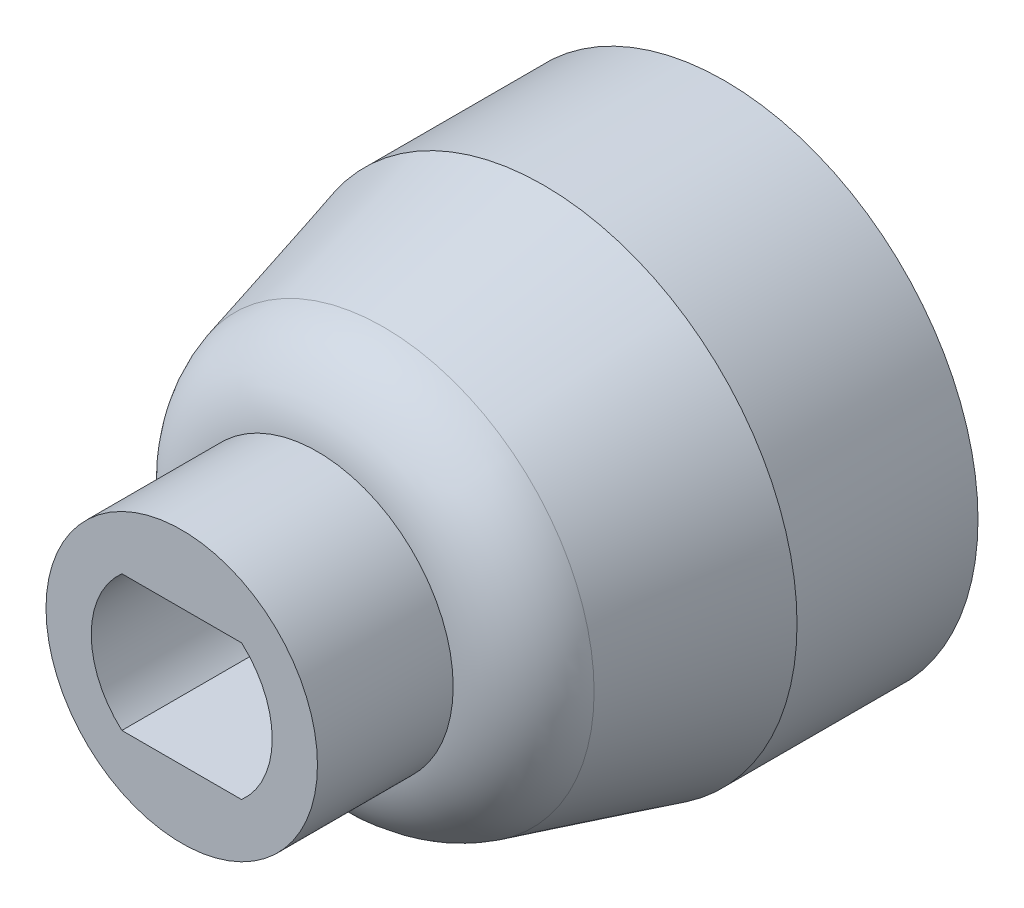
ISO-10303-21;
HEADER;
FILE_DESCRIPTION(('STEP AP214'),'2;1');
FILE_NAME('part.step','',(''),(''),'','','');
FILE_SCHEMA(('AUTOMOTIVE_DESIGN { 1 0 10303 214 1 1 1 1 }'));
ENDSEC;
DATA;
#1=APPLICATION_CONTEXT('core data for automotive mechanical design processes');
#2=APPLICATION_PROTOCOL_DEFINITION('international standard','automotive_design',2000,#1);
#3=PRODUCT_CONTEXT('',#1,'mechanical');
#4=PRODUCT('Part','Part','',(#3));
#5=PRODUCT_RELATED_PRODUCT_CATEGORY('part','',(#4));
#6=PRODUCT_DEFINITION_FORMATION('','',#4);
#7=PRODUCT_DEFINITION_CONTEXT('part definition',#1,'design');
#8=PRODUCT_DEFINITION('design','',#6,#7);
#9=PRODUCT_DEFINITION_SHAPE('','',#8);
#10=(LENGTH_UNIT() NAMED_UNIT(*) SI_UNIT(.MILLI.,.METRE.));
#11=(NAMED_UNIT(*) PLANE_ANGLE_UNIT() SI_UNIT($,.RADIAN.));
#12=(NAMED_UNIT(*) SI_UNIT($,.STERADIAN.) SOLID_ANGLE_UNIT());
#13=UNCERTAINTY_MEASURE_WITH_UNIT(LENGTH_MEASURE(1.E-05),#10,'distance_accuracy_value','');
#14=(GEOMETRIC_REPRESENTATION_CONTEXT(3) GLOBAL_UNCERTAINTY_ASSIGNED_CONTEXT((#13)) GLOBAL_UNIT_ASSIGNED_CONTEXT((#10,
#11,#12)) REPRESENTATION_CONTEXT('',''));
#15=CARTESIAN_POINT('',(0.,0.,0.));
#16=DIRECTION('',(0.,0.,1.));
#17=DIRECTION('',(1.,0.,0.));
#18=AXIS2_PLACEMENT_3D('',#15,#16,#17);
#19=CARTESIAN_POINT('',(0.,0.,9.));
#20=DIRECTION('',(0.,0.,-1.));
#21=DIRECTION('',(-1.,0.,0.));
#22=AXIS2_PLACEMENT_3D('',#19,#20,#21);
#23=CYLINDRICAL_SURFACE('',#22,5.6);
#24=CARTESIAN_POINT('',(0.,0.,3.99999999999992));
#25=DIRECTION('',(0.,0.,1.));
#26=DIRECTION('',(1.,0.,0.));
#27=AXIS2_PLACEMENT_3D('',#24,#25,#26);
#28=CIRCLE('',#27,5.6);
#29=CARTESIAN_POINT('',(5.6,0.,3.99999999999992));
#30=VERTEX_POINT('',#29);
#31=EDGE_CURVE('E48',#30,#30,#28,.F.);
#32=ORIENTED_EDGE('',*,*,#31,.T.);
#33=EDGE_LOOP('',(#32));
#34=FACE_BOUND('',#33,.T.);
#35=CARTESIAN_POINT('',(0.,0.,0.));
#36=DIRECTION('',(0.,0.,1.));
#37=DIRECTION('',(1.,0.,0.));
#38=AXIS2_PLACEMENT_3D('',#35,#36,#37);
#39=CIRCLE('',#38,5.6);
#40=CARTESIAN_POINT('',(5.6,0.,0.));
#41=VERTEX_POINT('',#40);
#42=EDGE_CURVE('E133',#41,#41,#39,.T.);
#43=ORIENTED_EDGE('',*,*,#42,.T.);
#44=EDGE_LOOP('',(#43));
#45=FACE_BOUND('',#44,.T.);
#46=ADVANCED_FACE('F39',(#34,#45),#23,.T.);
#47=CARTESIAN_POINT('',(0.,0.,0.));
#48=DIRECTION('',(0.,0.,1.));
#49=DIRECTION('',(1.,0.,0.));
#50=AXIS2_PLACEMENT_3D('',#47,#48,#49);
#51=PLANE('',#50);
#52=ORIENTED_EDGE('',*,*,#42,.F.);
#53=EDGE_LOOP('',(#52));
#54=FACE_BOUND('',#53,.T.);
#55=ADVANCED_FACE('F158',(#54),#51,.F.);
#56=CARTESIAN_POINT('',(0.,0.,12.));
#57=DIRECTION('',(0.,0.,1.));
#58=DIRECTION('',(1.,0.,0.));
#59=AXIS2_PLACEMENT_3D('',#56,#57,#58);
#60=PLANE('',#59);
#61=CARTESIAN_POINT('',(0.,0.,12.));
#62=DIRECTION('',(0.,0.,1.));
#63=DIRECTION('',(1.,0.,0.));
#64=AXIS2_PLACEMENT_3D('',#61,#62,#63);
#65=CIRCLE('',#64,3.);
#66=CARTESIAN_POINT('',(3.,0.,12.));
#67=VERTEX_POINT('',#66);
#68=EDGE_CURVE('E129',#67,#67,#65,.T.);
#69=ORIENTED_EDGE('',*,*,#68,.T.);
#70=EDGE_LOOP('',(#69));
#71=FACE_BOUND('',#70,.T.);
#72=DIRECTION('',(-1.,0.,0.));
#73=VECTOR('',#72,1.);
#74=CARTESIAN_POINT('',(-1.3228756555323,1.5,12.));
#75=LINE('',#74,#73);
#76=CARTESIAN_POINT('',(1.3228756555323,1.5,12.));
#77=VERTEX_POINT('',#76);
#78=CARTESIAN_POINT('',(-1.3228756555323,1.5,12.));
#79=VERTEX_POINT('',#78);
#80=EDGE_CURVE('E90',#77,#79,#75,.T.);
#81=ORIENTED_EDGE('',*,*,#80,.F.);
#82=CARTESIAN_POINT('',(0.,0.,12.));
#83=DIRECTION('',(0.,0.,1.));
#84=DIRECTION('',(1.,0.,0.));
#85=AXIS2_PLACEMENT_3D('',#82,#83,#84);
#86=CIRCLE('',#85,2.);
#87=CARTESIAN_POINT('',(1.3228756555323,-1.5,12.));
#88=VERTEX_POINT('',#87);
#89=EDGE_CURVE('E80',#88,#77,#86,.T.);
#90=ORIENTED_EDGE('',*,*,#89,.F.);
#91=DIRECTION('',(1.,0.,0.));
#92=VECTOR('',#91,1.);
#93=CARTESIAN_POINT('',(-1.3228756555323,-1.5,12.));
#94=LINE('',#93,#92);
#95=CARTESIAN_POINT('',(-1.3228756555323,-1.5,12.));
#96=VERTEX_POINT('',#95);
#97=EDGE_CURVE('E107',#96,#88,#94,.T.);
#98=ORIENTED_EDGE('',*,*,#97,.F.);
#99=CARTESIAN_POINT('',(0.,0.,12.));
#100=DIRECTION('',(0.,0.,1.));
#101=DIRECTION('',(1.,0.,0.));
#102=AXIS2_PLACEMENT_3D('',#99,#100,#101);
#103=CIRCLE('',#102,2.);
#104=EDGE_CURVE('E103',#79,#96,#103,.T.);
#105=ORIENTED_EDGE('',*,*,#104,.F.);
#106=EDGE_LOOP('',(#81,#90,#98,#105));
#107=FACE_BOUND('',#106,.T.);
#108=ADVANCED_FACE('F101',(#71,#107),#60,.T.);
#109=CARTESIAN_POINT('',(0.,0.,12.));
#110=DIRECTION('',(0.,0.,-1.));
#111=DIRECTION('',(-1.,0.,0.));
#112=AXIS2_PLACEMENT_3D('',#109,#110,#111);
#113=CYLINDRICAL_SURFACE('',#112,3.);
#114=ORIENTED_EDGE('',*,*,#68,.F.);
#115=EDGE_LOOP('',(#114));
#116=FACE_BOUND('',#115,.T.);
#117=CARTESIAN_POINT('',(0.,0.,9.));
#118=DIRECTION('',(0.,0.,1.));
#119=DIRECTION('',(1.,0.,0.));
#120=AXIS2_PLACEMENT_3D('',#117,#118,#119);
#121=CIRCLE('',#120,3.);
#122=CARTESIAN_POINT('',(3.,0.,9.));
#123=VERTEX_POINT('',#122);
#124=EDGE_CURVE('E97',#123,#123,#121,.T.);
#125=ORIENTED_EDGE('',*,*,#124,.T.);
#126=EDGE_LOOP('',(#125));
#127=FACE_BOUND('',#126,.T.);
#128=ADVANCED_FACE('F165',(#116,#127),#113,.T.);
#129=CARTESIAN_POINT('',(0.,0.,12.));
#130=DIRECTION('',(0.,0.,-1.));
#131=DIRECTION('',(-1.,0.,0.));
#132=AXIS2_PLACEMENT_3D('',#129,#130,#131);
#133=CYLINDRICAL_SURFACE('',#132,2.);
#134=CARTESIAN_POINT('',(0.,0.,9.));
#135=DIRECTION('',(0.,0.,1.));
#136=DIRECTION('',(1.,0.,0.));
#137=AXIS2_PLACEMENT_3D('',#134,#135,#136);
#138=CIRCLE('',#137,2.);
#139=CARTESIAN_POINT('',(1.3228756555323,-1.5,9.));
#140=VERTEX_POINT('',#139);
#141=CARTESIAN_POINT('',(1.3228756555323,1.5,9.));
#142=VERTEX_POINT('',#141);
#143=EDGE_CURVE('E55',#140,#142,#138,.T.);
#144=ORIENTED_EDGE('',*,*,#143,.F.);
#145=DIRECTION('',(0.,0.,-1.));
#146=VECTOR('',#145,1.);
#147=CARTESIAN_POINT('',(1.3228756555323,-1.5,12.));
#148=LINE('',#147,#146);
#149=EDGE_CURVE('E85',#88,#140,#148,.T.);
#150=ORIENTED_EDGE('',*,*,#149,.F.);
#151=ORIENTED_EDGE('',*,*,#89,.T.);
#152=DIRECTION('',(0.,0.,-1.));
#153=VECTOR('',#152,1.);
#154=CARTESIAN_POINT('',(1.3228756555323,1.5,12.));
#155=LINE('',#154,#153);
#156=EDGE_CURVE('E83',#77,#142,#155,.T.);
#157=ORIENTED_EDGE('',*,*,#156,.T.);
#158=EDGE_LOOP('',(#144,#150,#151,#157));
#159=FACE_BOUND('',#158,.T.);
#160=ADVANCED_FACE('F82',(#159),#133,.F.);
#161=CARTESIAN_POINT('',(-1.3228756555323,1.5,12.));
#162=DIRECTION('',(0.,-1.,0.));
#163=DIRECTION('',(0.,0.,-1.));
#164=AXIS2_PLACEMENT_3D('',#161,#162,#163);
#165=PLANE('',#164);
#166=DIRECTION('',(-1.,0.,0.));
#167=VECTOR('',#166,1.);
#168=CARTESIAN_POINT('',(-1.3228756555323,1.5,9.));
#169=LINE('',#168,#167);
#170=CARTESIAN_POINT('',(-1.3228756555323,1.5,9.));
#171=VERTEX_POINT('',#170);
#172=EDGE_CURVE('E59',#142,#171,#169,.T.);
#173=ORIENTED_EDGE('',*,*,#172,.F.);
#174=ORIENTED_EDGE('',*,*,#156,.F.);
#175=ORIENTED_EDGE('',*,*,#80,.T.);
#176=DIRECTION('',(0.,0.,-1.));
#177=VECTOR('',#176,1.);
#178=CARTESIAN_POINT('',(-1.3228756555323,1.5,12.));
#179=LINE('',#178,#177);
#180=EDGE_CURVE('E98',#79,#171,#179,.T.);
#181=ORIENTED_EDGE('',*,*,#180,.T.);
#182=EDGE_LOOP('',(#173,#174,#175,#181));
#183=FACE_BOUND('',#182,.T.);
#184=ADVANCED_FACE('F94',(#183),#165,.T.);
#185=CARTESIAN_POINT('',(0.,0.,12.));
#186=DIRECTION('',(0.,0.,-1.));
#187=DIRECTION('',(-1.,0.,0.));
#188=AXIS2_PLACEMENT_3D('',#185,#186,#187);
#189=CYLINDRICAL_SURFACE('',#188,2.);
#190=CARTESIAN_POINT('',(0.,0.,9.));
#191=DIRECTION('',(0.,0.,1.));
#192=DIRECTION('',(1.,0.,0.));
#193=AXIS2_PLACEMENT_3D('',#190,#191,#192);
#194=CIRCLE('',#193,2.);
#195=CARTESIAN_POINT('',(-1.3228756555323,-1.5,9.));
#196=VERTEX_POINT('',#195);
#197=EDGE_CURVE('E116',#171,#196,#194,.T.);
#198=ORIENTED_EDGE('',*,*,#197,.F.);
#199=ORIENTED_EDGE('',*,*,#180,.F.);
#200=ORIENTED_EDGE('',*,*,#104,.T.);
#201=DIRECTION('',(0.,0.,-1.));
#202=VECTOR('',#201,1.);
#203=CARTESIAN_POINT('',(-1.3228756555323,-1.5,12.));
#204=LINE('',#203,#202);
#205=EDGE_CURVE('E123',#96,#196,#204,.T.);
#206=ORIENTED_EDGE('',*,*,#205,.T.);
#207=EDGE_LOOP('',(#198,#199,#200,#206));
#208=FACE_BOUND('',#207,.T.);
#209=ADVANCED_FACE('F176',(#208),#189,.F.);
#210=CARTESIAN_POINT('',(-1.3228756555323,-1.5,12.));
#211=DIRECTION('',(0.,1.,0.));
#212=DIRECTION('',(0.,0.,1.));
#213=AXIS2_PLACEMENT_3D('',#210,#211,#212);
#214=PLANE('',#213);
#215=DIRECTION('',(1.,0.,0.));
#216=VECTOR('',#215,1.);
#217=CARTESIAN_POINT('',(-1.3228756555323,-1.5,9.));
#218=LINE('',#217,#216);
#219=EDGE_CURVE('E91',#196,#140,#218,.T.);
#220=ORIENTED_EDGE('',*,*,#219,.F.);
#221=ORIENTED_EDGE('',*,*,#205,.F.);
#222=ORIENTED_EDGE('',*,*,#97,.T.);
#223=ORIENTED_EDGE('',*,*,#149,.T.);
#224=EDGE_LOOP('',(#220,#221,#222,#223));
#225=FACE_BOUND('',#224,.T.);
#226=ADVANCED_FACE('F154',(#225),#214,.T.);
#227=CARTESIAN_POINT('',(0.,0.,9.));
#228=DIRECTION('',(0.,0.,1.));
#229=DIRECTION('',(1.,0.,0.));
#230=AXIS2_PLACEMENT_3D('',#227,#228,#229);
#231=PLANE('',#230);
#232=ORIENTED_EDGE('',*,*,#143,.T.);
#233=ORIENTED_EDGE('',*,*,#172,.T.);
#234=ORIENTED_EDGE('',*,*,#197,.T.);
#235=ORIENTED_EDGE('',*,*,#219,.T.);
#236=EDGE_LOOP('',(#232,#233,#234,#235));
#237=FACE_BOUND('',#236,.T.);
#238=ADVANCED_FACE('F147',(#237),#231,.T.);
#239=CARTESIAN_POINT('',(0.,0.,9.));
#240=DIRECTION('',(0.,0.,-1.));
#241=DIRECTION('',(-1.,0.,0.));
#242=AXIS2_PLACEMENT_3D('',#239,#240,#241);
#243=CONICAL_SURFACE('',#242,4.26025403784438,0.261799387799147);
#244=CARTESIAN_POINT('',(0.,0.,7.53728775245392));
#245=DIRECTION('',(0.,0.,-1.));
#246=DIRECTION('',(-1.,0.,0.));
#247=AXIS2_PLACEMENT_3D('',#244,#245,#246);
#248=CIRCLE('',#247,4.65218660333346);
#249=CARTESIAN_POINT('',(-4.65218660333346,0.,7.53728775245392));
#250=VERTEX_POINT('',#249);
#251=EDGE_CURVE('E11',#250,#250,#248,.T.);
#252=ORIENTED_EDGE('',*,*,#251,.T.);
#253=EDGE_LOOP('',(#252));
#254=FACE_BOUND('',#253,.T.);
#255=ORIENTED_EDGE('',*,*,#31,.F.);
#256=EDGE_LOOP('',(#255));
#257=FACE_BOUND('',#256,.T.);
#258=ADVANCED_FACE('F145',(#254,#257),#243,.T.);
#259=CARTESIAN_POINT('',(0.,0.,7.01964966224888));
#260=DIRECTION('',(0.,0.,1.));
#261=DIRECTION('',(1.,0.,0.));
#262=AXIS2_PLACEMENT_3D('',#259,#260,#261);
#263=TOROIDAL_SURFACE('',#262,2.72033495075532,2.);
#264=ORIENTED_EDGE('',*,*,#251,.F.);
#265=EDGE_LOOP('',(#264));
#266=FACE_BOUND('',#265,.T.);
#267=ORIENTED_EDGE('',*,*,#124,.F.);
#268=EDGE_LOOP('',(#267));
#269=FACE_BOUND('',#268,.T.);
#270=ADVANCED_FACE('F41',(#266,#269),#263,.T.);
#271=CLOSED_SHELL('',(#46,#55,#108,#128,#160,#184,#209,#226,#238,#258,#270));
#272=MANIFOLD_SOLID_BREP('B2',#271);
#273=ADVANCED_BREP_SHAPE_REPRESENTATION('',(#18,#272),#14);
#274=SHAPE_DEFINITION_REPRESENTATION(#9,#273);
ENDSEC;
END-ISO-10303-21;
